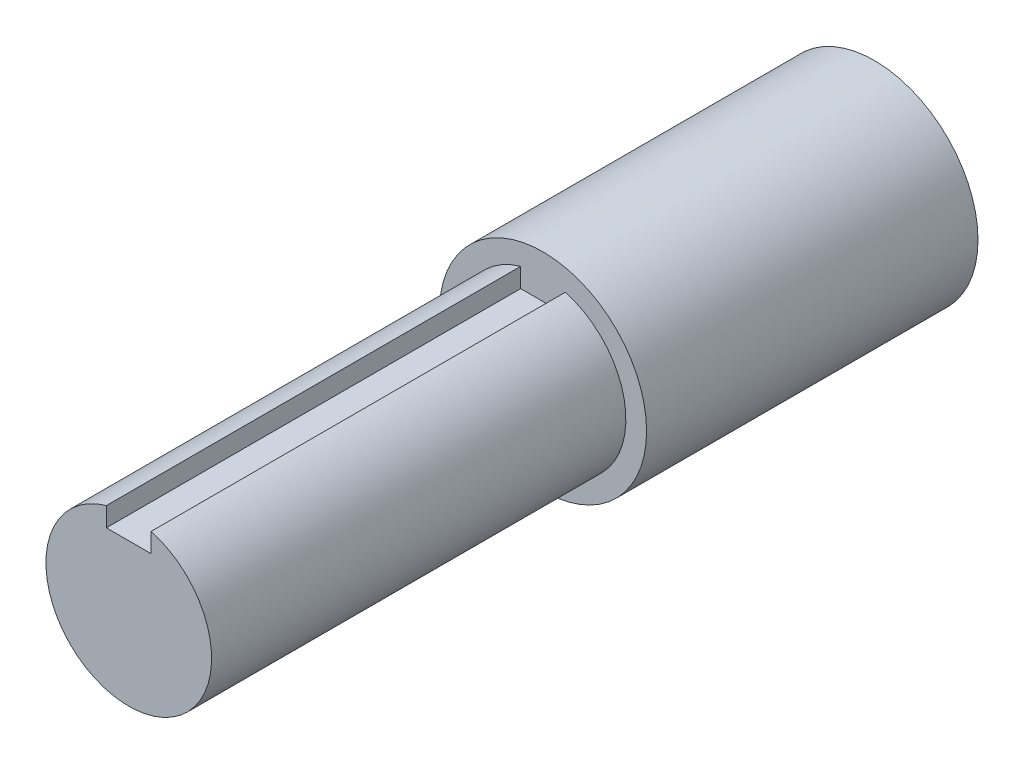
ISO-10303-21;
HEADER;
FILE_DESCRIPTION(('STEP AP214'),'2;1');
FILE_NAME('part.step','',(''),(''),'','','');
FILE_SCHEMA(('AUTOMOTIVE_DESIGN { 1 0 10303 214 1 1 1 1 }'));
ENDSEC;
DATA;
#1=APPLICATION_CONTEXT('core data for automotive mechanical design processes');
#2=APPLICATION_PROTOCOL_DEFINITION('international standard','automotive_design',2000,#1);
#3=PRODUCT_CONTEXT('',#1,'mechanical');
#4=PRODUCT('Part','Part','',(#3));
#5=PRODUCT_RELATED_PRODUCT_CATEGORY('part','',(#4));
#6=PRODUCT_DEFINITION_FORMATION('','',#4);
#7=PRODUCT_DEFINITION_CONTEXT('part definition',#1,'design');
#8=PRODUCT_DEFINITION('design','',#6,#7);
#9=PRODUCT_DEFINITION_SHAPE('','',#8);
#10=(LENGTH_UNIT() NAMED_UNIT(*) SI_UNIT(.MILLI.,.METRE.));
#11=(NAMED_UNIT(*) PLANE_ANGLE_UNIT() SI_UNIT($,.RADIAN.));
#12=(NAMED_UNIT(*) SI_UNIT($,.STERADIAN.) SOLID_ANGLE_UNIT());
#13=UNCERTAINTY_MEASURE_WITH_UNIT(LENGTH_MEASURE(1.E-05),#10,'distance_accuracy_value','');
#14=(GEOMETRIC_REPRESENTATION_CONTEXT(3) GLOBAL_UNCERTAINTY_ASSIGNED_CONTEXT((#13)) GLOBAL_UNIT_ASSIGNED_CONTEXT((#10,
#11,#12)) REPRESENTATION_CONTEXT('',''));
#15=CARTESIAN_POINT('',(0.,0.,0.));
#16=DIRECTION('',(0.,0.,1.));
#17=DIRECTION('',(1.,0.,0.));
#18=AXIS2_PLACEMENT_3D('',#15,#16,#17);
#19=CARTESIAN_POINT('',(0.,0.,57.15));
#20=DIRECTION('',(0.,0.,-1.));
#21=DIRECTION('',(-1.,0.,0.));
#22=AXIS2_PLACEMENT_3D('',#19,#20,#21);
#23=CYLINDRICAL_SURFACE('',#22,7.9375);
#24=CARTESIAN_POINT('',(0.,0.,0.));
#25=DIRECTION('',(0.,0.,1.));
#26=DIRECTION('',(1.,0.,0.));
#27=AXIS2_PLACEMENT_3D('',#24,#25,#26);
#28=CIRCLE('',#27,7.9375);
#29=CARTESIAN_POINT('',(7.9375,0.,0.));
#30=VERTEX_POINT('',#29);
#31=EDGE_CURVE('E13',#30,#30,#28,.T.);
#32=ORIENTED_EDGE('',*,*,#31,.T.);
#33=EDGE_LOOP('',(#32));
#34=FACE_BOUND('',#33,.T.);
#35=CARTESIAN_POINT('',(0.,0.,25.4));
#36=DIRECTION('',(0.,0.,1.));
#37=DIRECTION('',(1.,0.,0.));
#38=AXIS2_PLACEMENT_3D('',#35,#36,#37);
#39=CIRCLE('',#38,7.9375);
#40=CARTESIAN_POINT('',(7.9375,0.,25.4));
#41=VERTEX_POINT('',#40);
#42=EDGE_CURVE('E52',#41,#41,#39,.T.);
#43=ORIENTED_EDGE('',*,*,#42,.F.);
#44=EDGE_LOOP('',(#43));
#45=FACE_BOUND('',#44,.T.);
#46=ADVANCED_FACE('F49',(#34,#45),#23,.T.);
#47=CARTESIAN_POINT('',(0.,0.,0.));
#48=DIRECTION('',(0.,0.,1.));
#49=DIRECTION('',(1.,0.,0.));
#50=AXIS2_PLACEMENT_3D('',#47,#48,#49);
#51=PLANE('',#50);
#52=CARTESIAN_POINT('',(0.,0.,0.));
#53=DIRECTION('',(0.,0.,-1.));
#54=DIRECTION('',(-1.,0.,0.));
#55=AXIS2_PLACEMENT_3D('',#52,#53,#54);
#56=CIRCLE('',#55,3.8989);
#57=CARTESIAN_POINT('',(-3.8989,0.,0.));
#58=VERTEX_POINT('',#57);
#59=EDGE_CURVE('E129',#58,#58,#56,.T.);
#60=ORIENTED_EDGE('',*,*,#59,.F.);
#61=EDGE_LOOP('',(#60));
#62=FACE_BOUND('',#61,.T.);
#63=ORIENTED_EDGE('',*,*,#31,.F.);
#64=EDGE_LOOP('',(#63));
#65=FACE_BOUND('',#64,.T.);
#66=ADVANCED_FACE('F137',(#62,#65),#51,.F.);
#67=CARTESIAN_POINT('',(0.,0.,31.75));
#68=DIRECTION('',(0.,0.,-1.));
#69=DIRECTION('',(-1.,0.,0.));
#70=AXIS2_PLACEMENT_3D('',#67,#68,#69);
#71=CYLINDRICAL_SURFACE('',#70,3.8989);
#72=CARTESIAN_POINT('',(0.,0.,31.75));
#73=DIRECTION('',(0.,0.,-1.));
#74=DIRECTION('',(-1.,0.,0.));
#75=AXIS2_PLACEMENT_3D('',#72,#73,#74);
#76=CIRCLE('',#75,3.8989);
#77=CARTESIAN_POINT('',(-3.8989,0.,31.75));
#78=VERTEX_POINT('',#77);
#79=EDGE_CURVE('E57',#78,#78,#76,.T.);
#80=ORIENTED_EDGE('',*,*,#79,.F.);
#81=EDGE_LOOP('',(#80));
#82=FACE_BOUND('',#81,.T.);
#83=ORIENTED_EDGE('',*,*,#59,.T.);
#84=EDGE_LOOP('',(#83));
#85=FACE_BOUND('',#84,.T.);
#86=ADVANCED_FACE('F142',(#82,#85),#71,.F.);
#87=CARTESIAN_POINT('',(0.,0.,31.75));
#88=DIRECTION('',(0.,0.,-1.));
#89=DIRECTION('',(-1.,0.,0.));
#90=AXIS2_PLACEMENT_3D('',#87,#88,#89);
#91=PLANE('',#90);
#92=ORIENTED_EDGE('',*,*,#79,.T.);
#93=EDGE_LOOP('',(#92));
#94=FACE_BOUND('',#93,.T.);
#95=ADVANCED_FACE('F149',(#94),#91,.T.);
#96=CARTESIAN_POINT('',(0.,0.,25.4));
#97=DIRECTION('',(0.,0.,1.));
#98=DIRECTION('',(1.,0.,0.));
#99=AXIS2_PLACEMENT_3D('',#96,#97,#98);
#100=PLANE('',#99);
#101=DIRECTION('',(-1.,0.,0.));
#102=VECTOR('',#101,1.);
#103=CARTESIAN_POINT('',(-1.7145,4.6355,25.4));
#104=LINE('',#103,#102);
#105=CARTESIAN_POINT('',(1.7145,4.6355,25.4));
#106=VERTEX_POINT('',#105);
#107=CARTESIAN_POINT('',(-1.7145,4.6355,25.4));
#108=VERTEX_POINT('',#107);
#109=EDGE_CURVE('E102',#106,#108,#104,.T.);
#110=ORIENTED_EDGE('',*,*,#109,.F.);
#111=DIRECTION('',(0.,-1.,0.));
#112=VECTOR('',#111,1.);
#113=CARTESIAN_POINT('',(1.7145,4.6355,25.4));
#114=LINE('',#113,#112);
#115=CARTESIAN_POINT('',(1.7145,6.11416304574878,25.4));
#116=VERTEX_POINT('',#115);
#117=EDGE_CURVE('E72',#116,#106,#114,.T.);
#118=ORIENTED_EDGE('',*,*,#117,.F.);
#119=CARTESIAN_POINT('',(0.,0.,25.4));
#120=DIRECTION('',(0.,0.,1.));
#121=DIRECTION('',(1.,0.,0.));
#122=AXIS2_PLACEMENT_3D('',#119,#120,#121);
#123=CIRCLE('',#122,6.35);
#124=CARTESIAN_POINT('',(-1.7145,6.11416304574878,25.4));
#125=VERTEX_POINT('',#124);
#126=EDGE_CURVE('E94',#125,#116,#123,.T.);
#127=ORIENTED_EDGE('',*,*,#126,.F.);
#128=DIRECTION('',(0.,1.,0.));
#129=VECTOR('',#128,1.);
#130=CARTESIAN_POINT('',(-1.7145,4.6355,25.4));
#131=LINE('',#130,#129);
#132=EDGE_CURVE('E107',#108,#125,#131,.T.);
#133=ORIENTED_EDGE('',*,*,#132,.F.);
#134=EDGE_LOOP('',(#110,#118,#127,#133));
#135=FACE_BOUND('',#134,.T.);
#136=ORIENTED_EDGE('',*,*,#42,.T.);
#137=EDGE_LOOP('',(#136));
#138=FACE_BOUND('',#137,.T.);
#139=ADVANCED_FACE('F105',(#135,#138),#100,.T.);
#140=CARTESIAN_POINT('',(-1.7145,4.6355,25.4));
#141=DIRECTION('',(1.,0.,0.));
#142=DIRECTION('',(0.,0.,-1.));
#143=AXIS2_PLACEMENT_3D('',#140,#141,#142);
#144=PLANE('',#143);
#145=DIRECTION('',(0.,1.,0.));
#146=VECTOR('',#145,1.);
#147=CARTESIAN_POINT('',(-1.7145,4.6355,57.15));
#148=LINE('',#147,#146);
#149=CARTESIAN_POINT('',(-1.7145,4.6355,57.15));
#150=VERTEX_POINT('',#149);
#151=CARTESIAN_POINT('',(-1.7145,6.11416304574878,57.15));
#152=VERTEX_POINT('',#151);
#153=EDGE_CURVE('E119',#150,#152,#148,.T.);
#154=ORIENTED_EDGE('',*,*,#153,.F.);
#155=DIRECTION('',(0.,0.,1.));
#156=VECTOR('',#155,1.);
#157=CARTESIAN_POINT('',(-1.7145,4.6355,25.4));
#158=LINE('',#157,#156);
#159=EDGE_CURVE('E111',#108,#150,#158,.T.);
#160=ORIENTED_EDGE('',*,*,#159,.F.);
#161=ORIENTED_EDGE('',*,*,#132,.T.);
#162=DIRECTION('',(0.,0.,1.));
#163=VECTOR('',#162,1.);
#164=CARTESIAN_POINT('',(-1.7145,6.11416304574878,25.4));
#165=LINE('',#164,#163);
#166=EDGE_CURVE('E92',#125,#152,#165,.T.);
#167=ORIENTED_EDGE('',*,*,#166,.T.);
#168=EDGE_LOOP('',(#154,#160,#161,#167));
#169=FACE_BOUND('',#168,.T.);
#170=ADVANCED_FACE('F110',(#169),#144,.T.);
#171=CARTESIAN_POINT('',(-1.7145,4.6355,25.4));
#172=DIRECTION('',(0.,1.,0.));
#173=DIRECTION('',(0.,0.,1.));
#174=AXIS2_PLACEMENT_3D('',#171,#172,#173);
#175=PLANE('',#174);
#176=DIRECTION('',(-1.,0.,0.));
#177=VECTOR('',#176,1.);
#178=CARTESIAN_POINT('',(-1.7145,4.6355,57.15));
#179=LINE('',#178,#177);
#180=CARTESIAN_POINT('',(1.7145,4.6355,57.15));
#181=VERTEX_POINT('',#180);
#182=EDGE_CURVE('E112',#181,#150,#179,.T.);
#183=ORIENTED_EDGE('',*,*,#182,.F.);
#184=DIRECTION('',(0.,0.,1.));
#185=VECTOR('',#184,1.);
#186=CARTESIAN_POINT('',(1.7145,4.6355,25.4));
#187=LINE('',#186,#185);
#188=EDGE_CURVE('E124',#106,#181,#187,.T.);
#189=ORIENTED_EDGE('',*,*,#188,.F.);
#190=ORIENTED_EDGE('',*,*,#109,.T.);
#191=ORIENTED_EDGE('',*,*,#159,.T.);
#192=EDGE_LOOP('',(#183,#189,#190,#191));
#193=FACE_BOUND('',#192,.T.);
#194=ADVANCED_FACE('F164',(#193),#175,.T.);
#195=CARTESIAN_POINT('',(1.7145,4.6355,25.4));
#196=DIRECTION('',(-1.,0.,0.));
#197=DIRECTION('',(0.,0.,1.));
#198=AXIS2_PLACEMENT_3D('',#195,#196,#197);
#199=PLANE('',#198);
#200=DIRECTION('',(0.,-1.,0.));
#201=VECTOR('',#200,1.);
#202=CARTESIAN_POINT('',(1.7145,4.6355,57.15));
#203=LINE('',#202,#201);
#204=CARTESIAN_POINT('',(1.7145,6.11416304574878,57.15));
#205=VERTEX_POINT('',#204);
#206=EDGE_CURVE('E64',#205,#181,#203,.T.);
#207=ORIENTED_EDGE('',*,*,#206,.F.);
#208=DIRECTION('',(0.,0.,1.));
#209=VECTOR('',#208,1.);
#210=CARTESIAN_POINT('',(1.7145,6.11416304574878,25.4));
#211=LINE('',#210,#209);
#212=EDGE_CURVE('E101',#116,#205,#211,.T.);
#213=ORIENTED_EDGE('',*,*,#212,.F.);
#214=ORIENTED_EDGE('',*,*,#117,.T.);
#215=ORIENTED_EDGE('',*,*,#188,.T.);
#216=EDGE_LOOP('',(#207,#213,#214,#215));
#217=FACE_BOUND('',#216,.T.);
#218=ADVANCED_FACE('F167',(#217),#199,.T.);
#219=CARTESIAN_POINT('',(0.,0.,25.4));
#220=DIRECTION('',(0.,0.,1.));
#221=DIRECTION('',(1.,0.,0.));
#222=AXIS2_PLACEMENT_3D('',#219,#220,#221);
#223=CYLINDRICAL_SURFACE('',#222,6.35);
#224=CARTESIAN_POINT('',(0.,0.,57.15));
#225=DIRECTION('',(0.,0.,1.));
#226=DIRECTION('',(1.,0.,0.));
#227=AXIS2_PLACEMENT_3D('',#224,#225,#226);
#228=CIRCLE('',#227,6.35);
#229=EDGE_CURVE('E96',#152,#205,#228,.T.);
#230=ORIENTED_EDGE('',*,*,#229,.F.);
#231=ORIENTED_EDGE('',*,*,#166,.F.);
#232=ORIENTED_EDGE('',*,*,#126,.T.);
#233=ORIENTED_EDGE('',*,*,#212,.T.);
#234=EDGE_LOOP('',(#230,#231,#232,#233));
#235=FACE_BOUND('',#234,.T.);
#236=ADVANCED_FACE('F93',(#235),#223,.T.);
#237=CARTESIAN_POINT('',(0.,0.,57.15));
#238=DIRECTION('',(0.,0.,1.));
#239=DIRECTION('',(1.,0.,0.));
#240=AXIS2_PLACEMENT_3D('',#237,#238,#239);
#241=PLANE('',#240);
#242=ORIENTED_EDGE('',*,*,#182,.T.);
#243=ORIENTED_EDGE('',*,*,#153,.T.);
#244=ORIENTED_EDGE('',*,*,#229,.T.);
#245=ORIENTED_EDGE('',*,*,#206,.T.);
#246=EDGE_LOOP('',(#242,#243,#244,#245));
#247=FACE_BOUND('',#246,.T.);
#248=ADVANCED_FACE('F153',(#247),#241,.T.);
#249=CLOSED_SHELL('',(#46,#66,#86,#95,#139,#170,#194,#218,#236,#248));
#250=MANIFOLD_SOLID_BREP('B2',#249);
#251=ADVANCED_BREP_SHAPE_REPRESENTATION('',(#18,#250),#14);
#252=SHAPE_DEFINITION_REPRESENTATION(#9,#251);
ENDSEC;
END-ISO-10303-21;
